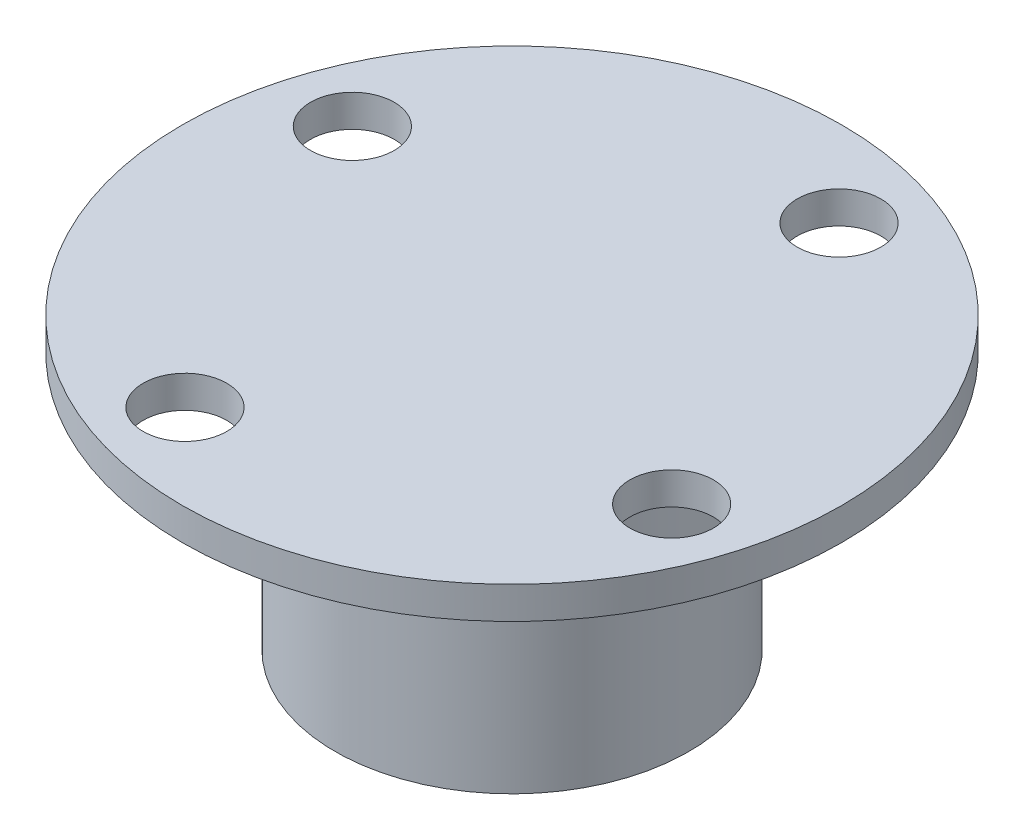
ISO-10303-21;
HEADER;
FILE_DESCRIPTION(('STEP AP214'),'2;1');
FILE_NAME('part.step','',(''),(''),'','','');
FILE_SCHEMA(('AUTOMOTIVE_DESIGN { 1 0 10303 214 1 1 1 1 }'));
ENDSEC;
DATA;
#1=APPLICATION_CONTEXT('core data for automotive mechanical design processes');
#2=APPLICATION_PROTOCOL_DEFINITION('international standard','automotive_design',2000,#1);
#3=PRODUCT_CONTEXT('',#1,'mechanical');
#4=PRODUCT('Part','Part','',(#3));
#5=PRODUCT_RELATED_PRODUCT_CATEGORY('part','',(#4));
#6=PRODUCT_DEFINITION_FORMATION('','',#4);
#7=PRODUCT_DEFINITION_CONTEXT('part definition',#1,'design');
#8=PRODUCT_DEFINITION('design','',#6,#7);
#9=PRODUCT_DEFINITION_SHAPE('','',#8);
#10=(LENGTH_UNIT() NAMED_UNIT(*) SI_UNIT(.MILLI.,.METRE.));
#11=(NAMED_UNIT(*) PLANE_ANGLE_UNIT() SI_UNIT($,.RADIAN.));
#12=(NAMED_UNIT(*) SI_UNIT($,.STERADIAN.) SOLID_ANGLE_UNIT());
#13=UNCERTAINTY_MEASURE_WITH_UNIT(LENGTH_MEASURE(1.E-05),#10,'distance_accuracy_value','');
#14=(GEOMETRIC_REPRESENTATION_CONTEXT(3) GLOBAL_UNCERTAINTY_ASSIGNED_CONTEXT((#13)) GLOBAL_UNIT_ASSIGNED_CONTEXT((#10,
#11,#12)) REPRESENTATION_CONTEXT('',''));
#15=CARTESIAN_POINT('',(0.,0.,0.));
#16=DIRECTION('',(0.,0.,1.));
#17=DIRECTION('',(1.,0.,0.));
#18=AXIS2_PLACEMENT_3D('',#15,#16,#17);
#19=CARTESIAN_POINT('',(14.017249305254,-39.6012905750699,17.2499999999998));
#20=DIRECTION('',(0.,1.,0.));
#21=DIRECTION('',(0.,0.,1.));
#22=AXIS2_PLACEMENT_3D('',#19,#20,#21);
#23=CYLINDRICAL_SURFACE('',#22,10.25);
#24=CARTESIAN_POINT('',(14.017249305254,-39.6012905750699,17.2499999999998));
#25=DIRECTION('',(0.,-1.,0.));
#26=DIRECTION('',(0.,0.,-1.));
#27=AXIS2_PLACEMENT_3D('',#24,#25,#26);
#28=CIRCLE('',#27,10.25);
#29=CARTESIAN_POINT('',(14.017249305254,-39.6012905750697,6.99999999999979));
#30=VERTEX_POINT('',#29);
#31=EDGE_CURVE('E111',#30,#30,#28,.T.);
#32=ORIENTED_EDGE('',*,*,#31,.F.);
#33=EDGE_LOOP('',(#32));
#34=FACE_BOUND('',#33,.T.);
#35=CARTESIAN_POINT('',(14.017249305254,-38.6012905750699,17.2499999999998));
#36=DIRECTION('',(0.,-1.,0.));
#37=DIRECTION('',(0.,0.,-1.));
#38=AXIS2_PLACEMENT_3D('',#35,#36,#37);
#39=CIRCLE('',#38,10.25);
#40=CARTESIAN_POINT('',(14.017249305254,-38.6012905750697,6.99999999999981));
#41=VERTEX_POINT('',#40);
#42=EDGE_CURVE('E110',#41,#41,#39,.T.);
#43=ORIENTED_EDGE('',*,*,#42,.T.);
#44=EDGE_LOOP('',(#43));
#45=FACE_BOUND('',#44,.T.);
#46=ADVANCED_FACE('F37',(#34,#45),#23,.T.);
#47=CARTESIAN_POINT('',(14.017249305254,-39.6012905750699,17.2499999999998));
#48=DIRECTION('',(0.,-1.,0.));
#49=DIRECTION('',(0.,0.,-1.));
#50=AXIS2_PLACEMENT_3D('',#47,#48,#49);
#51=PLANE('',#50);
#52=CARTESIAN_POINT('',(14.017249305254,-39.6012905750699,17.2499999999998));
#53=DIRECTION('',(0.,-1.,0.));
#54=DIRECTION('',(0.,0.,-1.));
#55=AXIS2_PLACEMENT_3D('',#52,#53,#54);
#56=CIRCLE('',#55,6.00000000000029);
#57=CARTESIAN_POINT('',(14.017249305254,-39.6012905750698,11.2499999999995));
#58=VERTEX_POINT('',#57);
#59=EDGE_CURVE('E11',#58,#58,#56,.F.);
#60=ORIENTED_EDGE('',*,*,#59,.T.);
#61=EDGE_LOOP('',(#60));
#62=FACE_BOUND('',#61,.T.);
#63=CARTESIAN_POINT('',(21.5823670466117,-39.6012905750699,19.8517289557862));
#64=DIRECTION('',(0.,-1.,0.));
#65=DIRECTION('',(0.,0.,-1.));
#66=AXIS2_PLACEMENT_3D('',#63,#64,#65);
#67=CIRCLE('',#66,1.3);
#68=CARTESIAN_POINT('',(21.5823670466117,-39.6012905750699,18.5517289557862));
#69=VERTEX_POINT('',#68);
#70=EDGE_CURVE('E86',#69,#69,#67,.T.);
#71=ORIENTED_EDGE('',*,*,#70,.F.);
#72=EDGE_LOOP('',(#71));
#73=FACE_BOUND('',#72,.T.);
#74=CARTESIAN_POINT('',(16.6189782610404,-39.6012905750698,9.68488225864214));
#75=DIRECTION('',(0.,-1.,0.));
#76=DIRECTION('',(0.,0.,-1.));
#77=AXIS2_PLACEMENT_3D('',#74,#75,#76);
#78=CIRCLE('',#77,1.3);
#79=CARTESIAN_POINT('',(16.6189782610404,-39.6012905750698,8.38488225864214));
#80=VERTEX_POINT('',#79);
#81=EDGE_CURVE('E92',#80,#80,#78,.T.);
#82=ORIENTED_EDGE('',*,*,#81,.F.);
#83=EDGE_LOOP('',(#82));
#84=FACE_BOUND('',#83,.T.);
#85=CARTESIAN_POINT('',(6.45213156389637,-39.6012905750698,14.6482710442134));
#86=DIRECTION('',(0.,-1.,0.));
#87=DIRECTION('',(0.,0.,-1.));
#88=AXIS2_PLACEMENT_3D('',#85,#86,#87);
#89=CIRCLE('',#88,1.3);
#90=CARTESIAN_POINT('',(6.45213156389637,-39.6012905750698,13.3482710442134));
#91=VERTEX_POINT('',#90);
#92=EDGE_CURVE('E98',#91,#91,#89,.T.);
#93=ORIENTED_EDGE('',*,*,#92,.F.);
#94=EDGE_LOOP('',(#93));
#95=FACE_BOUND('',#94,.T.);
#96=CARTESIAN_POINT('',(11.4155203494677,-39.60129057507,24.8151177413574));
#97=DIRECTION('',(0.,-1.,0.));
#98=DIRECTION('',(0.,0.,-1.));
#99=AXIS2_PLACEMENT_3D('',#96,#97,#98);
#100=CIRCLE('',#99,1.3);
#101=CARTESIAN_POINT('',(11.4155203494677,-39.60129057507,23.5151177413575));
#102=VERTEX_POINT('',#101);
#103=EDGE_CURVE('E104',#102,#102,#100,.T.);
#104=ORIENTED_EDGE('',*,*,#103,.F.);
#105=EDGE_LOOP('',(#104));
#106=FACE_BOUND('',#105,.T.);
#107=ORIENTED_EDGE('',*,*,#31,.T.);
#108=EDGE_LOOP('',(#107));
#109=FACE_BOUND('',#108,.T.);
#110=ADVANCED_FACE('F131',(#62,#73,#84,#95,#106,#109),#51,.T.);
#111=CARTESIAN_POINT('',(14.017249305254,-38.6012905750699,17.2499999999998));
#112=DIRECTION('',(0.,-1.,0.));
#113=DIRECTION('',(0.,0.,-1.));
#114=AXIS2_PLACEMENT_3D('',#111,#112,#113);
#115=PLANE('',#114);
#116=CARTESIAN_POINT('',(21.5823670466117,-38.6012905750699,19.8517289557862));
#117=DIRECTION('',(0.,-1.,0.));
#118=DIRECTION('',(0.,0.,-1.));
#119=AXIS2_PLACEMENT_3D('',#116,#117,#118);
#120=CIRCLE('',#119,1.3);
#121=CARTESIAN_POINT('',(21.5823670466117,-38.6012905750699,18.5517289557862));
#122=VERTEX_POINT('',#121);
#123=EDGE_CURVE('E89',#122,#122,#120,.T.);
#124=ORIENTED_EDGE('',*,*,#123,.T.);
#125=EDGE_LOOP('',(#124));
#126=FACE_BOUND('',#125,.T.);
#127=CARTESIAN_POINT('',(16.6189782610404,-38.6012905750698,9.68488225864214));
#128=DIRECTION('',(0.,-1.,0.));
#129=DIRECTION('',(0.,0.,-1.));
#130=AXIS2_PLACEMENT_3D('',#127,#128,#129);
#131=CIRCLE('',#130,1.3);
#132=CARTESIAN_POINT('',(16.6189782610404,-38.6012905750698,8.38488225864214));
#133=VERTEX_POINT('',#132);
#134=EDGE_CURVE('E95',#133,#133,#131,.T.);
#135=ORIENTED_EDGE('',*,*,#134,.T.);
#136=EDGE_LOOP('',(#135));
#137=FACE_BOUND('',#136,.T.);
#138=CARTESIAN_POINT('',(6.45213156389637,-38.6012905750698,14.6482710442134));
#139=DIRECTION('',(0.,-1.,0.));
#140=DIRECTION('',(0.,0.,-1.));
#141=AXIS2_PLACEMENT_3D('',#138,#139,#140);
#142=CIRCLE('',#141,1.3);
#143=CARTESIAN_POINT('',(6.45213156389637,-38.6012905750698,13.3482710442134));
#144=VERTEX_POINT('',#143);
#145=EDGE_CURVE('E101',#144,#144,#142,.T.);
#146=ORIENTED_EDGE('',*,*,#145,.T.);
#147=EDGE_LOOP('',(#146));
#148=FACE_BOUND('',#147,.T.);
#149=CARTESIAN_POINT('',(11.4155203494677,-38.60129057507,24.8151177413574));
#150=DIRECTION('',(0.,-1.,0.));
#151=DIRECTION('',(0.,0.,-1.));
#152=AXIS2_PLACEMENT_3D('',#149,#150,#151);
#153=CIRCLE('',#152,1.3);
#154=CARTESIAN_POINT('',(11.4155203494677,-38.60129057507,23.5151177413575));
#155=VERTEX_POINT('',#154);
#156=EDGE_CURVE('E107',#155,#155,#153,.T.);
#157=ORIENTED_EDGE('',*,*,#156,.T.);
#158=EDGE_LOOP('',(#157));
#159=FACE_BOUND('',#158,.T.);
#160=ORIENTED_EDGE('',*,*,#42,.F.);
#161=EDGE_LOOP('',(#160));
#162=FACE_BOUND('',#161,.T.);
#163=ADVANCED_FACE('F136',(#126,#137,#148,#159,#162),#115,.F.);
#164=CARTESIAN_POINT('',(11.4155203494677,-39.60129057507,24.8151177413574));
#165=DIRECTION('',(0.,-1.,0.));
#166=DIRECTION('',(0.,0.,-1.));
#167=AXIS2_PLACEMENT_3D('',#164,#165,#166);
#168=CYLINDRICAL_SURFACE('',#167,1.3);
#169=ORIENTED_EDGE('',*,*,#156,.F.);
#170=EDGE_LOOP('',(#169));
#171=FACE_BOUND('',#170,.T.);
#172=ORIENTED_EDGE('',*,*,#103,.T.);
#173=EDGE_LOOP('',(#172));
#174=FACE_BOUND('',#173,.T.);
#175=ADVANCED_FACE('F143',(#171,#174),#168,.F.);
#176=CARTESIAN_POINT('',(6.45213156389637,-39.6012905750698,14.6482710442134));
#177=DIRECTION('',(0.,-1.,0.));
#178=DIRECTION('',(0.,0.,-1.));
#179=AXIS2_PLACEMENT_3D('',#176,#177,#178);
#180=CYLINDRICAL_SURFACE('',#179,1.3);
#181=ORIENTED_EDGE('',*,*,#145,.F.);
#182=EDGE_LOOP('',(#181));
#183=FACE_BOUND('',#182,.T.);
#184=ORIENTED_EDGE('',*,*,#92,.T.);
#185=EDGE_LOOP('',(#184));
#186=FACE_BOUND('',#185,.T.);
#187=ADVANCED_FACE('F148',(#183,#186),#180,.F.);
#188=CARTESIAN_POINT('',(16.6189782610404,-39.6012905750698,9.68488225864214));
#189=DIRECTION('',(0.,-1.,0.));
#190=DIRECTION('',(0.,0.,-1.));
#191=AXIS2_PLACEMENT_3D('',#188,#189,#190);
#192=CYLINDRICAL_SURFACE('',#191,1.3);
#193=ORIENTED_EDGE('',*,*,#134,.F.);
#194=EDGE_LOOP('',(#193));
#195=FACE_BOUND('',#194,.T.);
#196=ORIENTED_EDGE('',*,*,#81,.T.);
#197=EDGE_LOOP('',(#196));
#198=FACE_BOUND('',#197,.T.);
#199=ADVANCED_FACE('F152',(#195,#198),#192,.F.);
#200=CARTESIAN_POINT('',(21.5823670466117,-39.6012905750699,19.8517289557862));
#201=DIRECTION('',(0.,-1.,0.));
#202=DIRECTION('',(0.,0.,-1.));
#203=AXIS2_PLACEMENT_3D('',#200,#201,#202);
#204=CYLINDRICAL_SURFACE('',#203,1.3);
#205=ORIENTED_EDGE('',*,*,#123,.F.);
#206=EDGE_LOOP('',(#205));
#207=FACE_BOUND('',#206,.T.);
#208=ORIENTED_EDGE('',*,*,#70,.T.);
#209=EDGE_LOOP('',(#208));
#210=FACE_BOUND('',#209,.T.);
#211=ADVANCED_FACE('F156',(#207,#210),#204,.F.);
#212=CARTESIAN_POINT('',(14.017249305254,-47.6012905750699,17.2499999999997));
#213=DIRECTION('',(0.,1.,0.));
#214=DIRECTION('',(0.,0.,1.));
#215=AXIS2_PLACEMENT_3D('',#212,#213,#214);
#216=CYLINDRICAL_SURFACE('',#215,5.50000000000029);
#217=CARTESIAN_POINT('',(14.017249305254,-40.1012905750699,17.2499999999998));
#218=DIRECTION('',(0.,-1.,0.));
#219=DIRECTION('',(0.,0.,-1.));
#220=AXIS2_PLACEMENT_3D('',#217,#218,#219);
#221=CIRCLE('',#220,5.50000000000029);
#222=CARTESIAN_POINT('',(14.017249305254,-40.1012905750698,11.7499999999995));
#223=VERTEX_POINT('',#222);
#224=EDGE_CURVE('E45',#223,#223,#221,.T.);
#225=ORIENTED_EDGE('',*,*,#224,.T.);
#226=EDGE_LOOP('',(#225));
#227=FACE_BOUND('',#226,.T.);
#228=CARTESIAN_POINT('',(14.017249305254,-47.6012905750699,17.2499999999997));
#229=DIRECTION('',(0.,-1.,0.));
#230=DIRECTION('',(0.,0.,-1.));
#231=AXIS2_PLACEMENT_3D('',#228,#229,#230);
#232=CIRCLE('',#231,5.50000000000029);
#233=CARTESIAN_POINT('',(14.017249305254,-47.6012905750698,11.7499999999994));
#234=VERTEX_POINT('',#233);
#235=EDGE_CURVE('E68',#234,#234,#232,.T.);
#236=ORIENTED_EDGE('',*,*,#235,.F.);
#237=EDGE_LOOP('',(#236));
#238=FACE_BOUND('',#237,.T.);
#239=ADVANCED_FACE('F118',(#227,#238),#216,.T.);
#240=CARTESIAN_POINT('',(14.017249305254,-47.6012905750699,17.2499999999997));
#241=DIRECTION('',(0.,-1.,0.));
#242=DIRECTION('',(0.,0.,-1.));
#243=AXIS2_PLACEMENT_3D('',#240,#241,#242);
#244=PLANE('',#243);
#245=CARTESIAN_POINT('',(14.017249305254,-47.6012905750699,17.2499999999997));
#246=DIRECTION('',(0.,-1.,0.));
#247=DIRECTION('',(0.,0.,-1.));
#248=AXIS2_PLACEMENT_3D('',#245,#246,#247);
#249=CIRCLE('',#248,3.35);
#250=CARTESIAN_POINT('',(11.9047862878262,-47.6012905750699,19.8499999999997));
#251=VERTEX_POINT('',#250);
#252=CARTESIAN_POINT('',(16.1297123226818,-47.6012905750699,19.8499999999997));
#253=VERTEX_POINT('',#252);
#254=EDGE_CURVE('E52',#251,#253,#249,.T.);
#255=ORIENTED_EDGE('',*,*,#254,.F.);
#256=DIRECTION('',(-1.,0.,0.));
#257=VECTOR('',#256,1.);
#258=CARTESIAN_POINT('',(11.9047862878262,-47.6012905750699,19.8499999999997));
#259=LINE('',#258,#257);
#260=EDGE_CURVE('E72',#253,#251,#259,.T.);
#261=ORIENTED_EDGE('',*,*,#260,.F.);
#262=EDGE_LOOP('',(#255,#261));
#263=FACE_BOUND('',#262,.T.);
#264=ORIENTED_EDGE('',*,*,#235,.T.);
#265=EDGE_LOOP('',(#264));
#266=FACE_BOUND('',#265,.T.);
#267=ADVANCED_FACE('F76',(#263,#266),#244,.T.);
#268=CARTESIAN_POINT('',(14.017249305254,-41.6012905750699,17.2499999999998));
#269=DIRECTION('',(0.,-1.,0.));
#270=DIRECTION('',(0.,0.,-1.));
#271=AXIS2_PLACEMENT_3D('',#268,#269,#270);
#272=CYLINDRICAL_SURFACE('',#271,3.35);
#273=ORIENTED_EDGE('',*,*,#254,.T.);
#274=DIRECTION('',(0.,-1.,0.));
#275=VECTOR('',#274,1.);
#276=CARTESIAN_POINT('',(16.1297123226818,-41.6012905750699,19.8499999999998));
#277=LINE('',#276,#275);
#278=CARTESIAN_POINT('',(16.1297123226818,-41.6012905750699,19.8499999999998));
#279=VERTEX_POINT('',#278);
#280=EDGE_CURVE('E69',#279,#253,#277,.T.);
#281=ORIENTED_EDGE('',*,*,#280,.F.);
#282=CARTESIAN_POINT('',(14.017249305254,-41.6012905750699,17.2499999999998));
#283=DIRECTION('',(0.,-1.,0.));
#284=DIRECTION('',(0.,0.,-1.));
#285=AXIS2_PLACEMENT_3D('',#282,#283,#284);
#286=CIRCLE('',#285,3.35);
#287=CARTESIAN_POINT('',(11.9047862878263,-41.6012905750699,19.8499999999998));
#288=VERTEX_POINT('',#287);
#289=EDGE_CURVE('E66',#288,#279,#286,.T.);
#290=ORIENTED_EDGE('',*,*,#289,.F.);
#291=DIRECTION('',(0.,-1.,0.));
#292=VECTOR('',#291,1.);
#293=CARTESIAN_POINT('',(11.9047862878263,-41.6012905750699,19.8499999999998));
#294=LINE('',#293,#292);
#295=EDGE_CURVE('E60',#288,#251,#294,.T.);
#296=ORIENTED_EDGE('',*,*,#295,.T.);
#297=EDGE_LOOP('',(#273,#281,#290,#296));
#298=FACE_BOUND('',#297,.T.);
#299=ADVANCED_FACE('F64',(#298),#272,.F.);
#300=CARTESIAN_POINT('',(11.9047862878263,-41.6012905750699,19.8499999999998));
#301=DIRECTION('',(0.,0.,1.));
#302=DIRECTION('',(0.,-1.,0.));
#303=AXIS2_PLACEMENT_3D('',#300,#301,#302);
#304=PLANE('',#303);
#305=ORIENTED_EDGE('',*,*,#260,.T.);
#306=ORIENTED_EDGE('',*,*,#295,.F.);
#307=DIRECTION('',(-1.,0.,0.));
#308=VECTOR('',#307,1.);
#309=CARTESIAN_POINT('',(11.9047862878263,-41.6012905750699,19.8499999999998));
#310=LINE('',#309,#308);
#311=EDGE_CURVE('E80',#279,#288,#310,.T.);
#312=ORIENTED_EDGE('',*,*,#311,.F.);
#313=ORIENTED_EDGE('',*,*,#280,.T.);
#314=EDGE_LOOP('',(#305,#306,#312,#313));
#315=FACE_BOUND('',#314,.T.);
#316=ADVANCED_FACE('F73',(#315),#304,.F.);
#317=CARTESIAN_POINT('',(14.017249305254,-41.6012905750699,17.2499999999998));
#318=DIRECTION('',(0.,-1.,0.));
#319=DIRECTION('',(0.,0.,-1.));
#320=AXIS2_PLACEMENT_3D('',#317,#318,#319);
#321=PLANE('',#320);
#322=ORIENTED_EDGE('',*,*,#289,.T.);
#323=ORIENTED_EDGE('',*,*,#311,.T.);
#324=EDGE_LOOP('',(#322,#323));
#325=FACE_BOUND('',#324,.T.);
#326=ADVANCED_FACE('F122',(#325),#321,.T.);
#327=CARTESIAN_POINT('',(14.017249305254,-40.1012905750699,17.2499999999998));
#328=DIRECTION('',(0.,-1.,0.));
#329=DIRECTION('',(0.,0.,-1.));
#330=AXIS2_PLACEMENT_3D('',#327,#328,#329);
#331=TOROIDAL_SURFACE('',#330,6.00000000000029,0.5);
#332=ORIENTED_EDGE('',*,*,#59,.F.);
#333=EDGE_LOOP('',(#332));
#334=FACE_BOUND('',#333,.T.);
#335=ORIENTED_EDGE('',*,*,#224,.F.);
#336=EDGE_LOOP('',(#335));
#337=FACE_BOUND('',#336,.T.);
#338=ADVANCED_FACE('F39',(#334,#337),#331,.F.);
#339=CLOSED_SHELL('',(#46,#110,#163,#175,#187,#199,#211,#239,#267,#299,#316,#326,#338));
#340=MANIFOLD_SOLID_BREP('B2',#339);
#341=ADVANCED_BREP_SHAPE_REPRESENTATION('',(#18,#340),#14);
#342=SHAPE_DEFINITION_REPRESENTATION(#9,#341);
ENDSEC;
END-ISO-10303-21;
